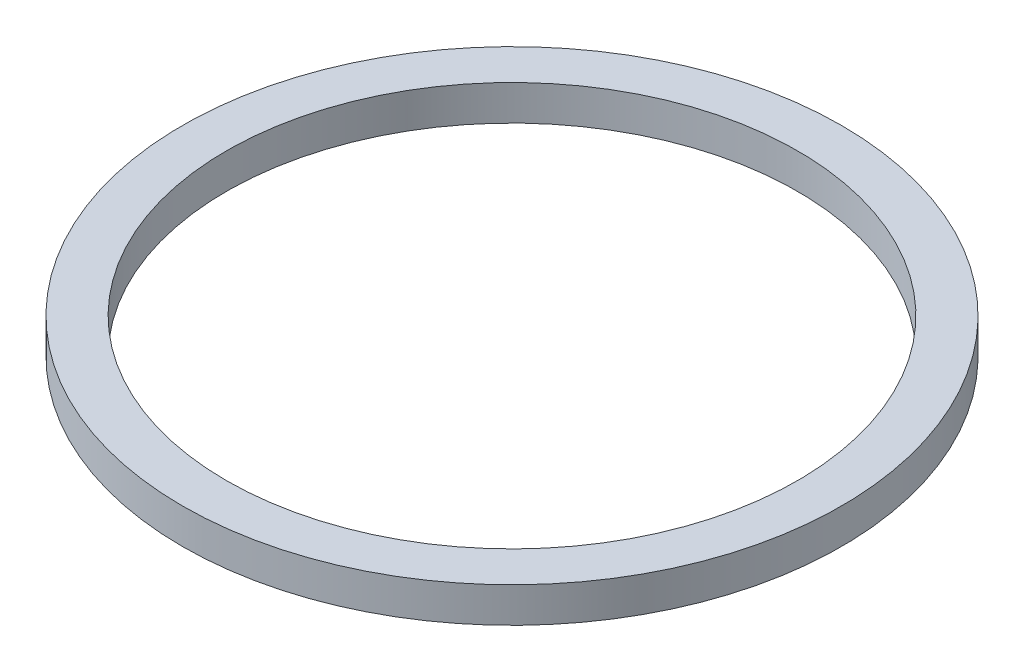
ISO-10303-21;
HEADER;
FILE_DESCRIPTION(('STEP AP214'),'2;1');
FILE_NAME('part.step','',(''),(''),'','','');
FILE_SCHEMA(('AUTOMOTIVE_DESIGN { 1 0 10303 214 1 1 1 1 }'));
ENDSEC;
DATA;
#1=APPLICATION_CONTEXT('core data for automotive mechanical design processes');
#2=APPLICATION_PROTOCOL_DEFINITION('international standard','automotive_design',2000,#1);
#3=PRODUCT_CONTEXT('',#1,'mechanical');
#4=PRODUCT('Part','Part','',(#3));
#5=PRODUCT_RELATED_PRODUCT_CATEGORY('part','',(#4));
#6=PRODUCT_DEFINITION_FORMATION('','',#4);
#7=PRODUCT_DEFINITION_CONTEXT('part definition',#1,'design');
#8=PRODUCT_DEFINITION('design','',#6,#7);
#9=PRODUCT_DEFINITION_SHAPE('','',#8);
#10=(LENGTH_UNIT() NAMED_UNIT(*) SI_UNIT(.MILLI.,.METRE.));
#11=(NAMED_UNIT(*) PLANE_ANGLE_UNIT() SI_UNIT($,.RADIAN.));
#12=(NAMED_UNIT(*) SI_UNIT($,.STERADIAN.) SOLID_ANGLE_UNIT());
#13=UNCERTAINTY_MEASURE_WITH_UNIT(LENGTH_MEASURE(1.E-05),#10,'distance_accuracy_value','');
#14=(GEOMETRIC_REPRESENTATION_CONTEXT(3) GLOBAL_UNCERTAINTY_ASSIGNED_CONTEXT((#13)) GLOBAL_UNIT_ASSIGNED_CONTEXT((#10,
#11,#12)) REPRESENTATION_CONTEXT('',''));
#15=CARTESIAN_POINT('',(0.,0.,0.));
#16=DIRECTION('',(0.,0.,1.));
#17=DIRECTION('',(1.,0.,0.));
#18=AXIS2_PLACEMENT_3D('',#15,#16,#17);
#19=CARTESIAN_POINT('',(0.,2.54,0.));
#20=DIRECTION('',(0.,1.,0.));
#21=DIRECTION('',(0.,0.,1.));
#22=AXIS2_PLACEMENT_3D('',#19,#20,#21);
#23=PLANE('',#22);
#24=CARTESIAN_POINT('',(0.,2.54,0.));
#25=DIRECTION('',(0.,1.,0.));
#26=DIRECTION('',(0.,0.,1.));
#27=AXIS2_PLACEMENT_3D('',#24,#25,#26);
#28=CIRCLE('',#27,23.8125);
#29=CARTESIAN_POINT('',(0.,2.54,23.8125));
#30=VERTEX_POINT('',#29);
#31=EDGE_CURVE('E10',#30,#30,#28,.T.);
#32=ORIENTED_EDGE('',*,*,#31,.T.);
#33=EDGE_LOOP('',(#32));
#34=FACE_BOUND('',#33,.T.);
#35=CARTESIAN_POINT('',(0.,2.54,0.));
#36=DIRECTION('',(0.,1.,0.));
#37=DIRECTION('',(0.,0.,1.));
#38=AXIS2_PLACEMENT_3D('',#35,#36,#37);
#39=CIRCLE('',#38,20.6375);
#40=CARTESIAN_POINT('',(0.,2.54,20.6375));
#41=VERTEX_POINT('',#40);
#42=EDGE_CURVE('E46',#41,#41,#39,.T.);
#43=ORIENTED_EDGE('',*,*,#42,.F.);
#44=EDGE_LOOP('',(#43));
#45=FACE_BOUND('',#44,.T.);
#46=ADVANCED_FACE('F35',(#34,#45),#23,.T.);
#47=CARTESIAN_POINT('',(0.,0.,0.));
#48=DIRECTION('',(0.,1.,0.));
#49=DIRECTION('',(0.,0.,1.));
#50=AXIS2_PLACEMENT_3D('',#47,#48,#49);
#51=PLANE('',#50);
#52=CARTESIAN_POINT('',(0.,0.,0.));
#53=DIRECTION('',(0.,1.,0.));
#54=DIRECTION('',(0.,0.,1.));
#55=AXIS2_PLACEMENT_3D('',#52,#53,#54);
#56=CIRCLE('',#55,23.8125);
#57=CARTESIAN_POINT('',(0.,0.,23.8125));
#58=VERTEX_POINT('',#57);
#59=EDGE_CURVE('E39',#58,#58,#56,.T.);
#60=ORIENTED_EDGE('',*,*,#59,.F.);
#61=EDGE_LOOP('',(#60));
#62=FACE_BOUND('',#61,.T.);
#63=CARTESIAN_POINT('',(0.,0.,0.));
#64=DIRECTION('',(0.,1.,0.));
#65=DIRECTION('',(0.,0.,1.));
#66=AXIS2_PLACEMENT_3D('',#63,#64,#65);
#67=CIRCLE('',#66,20.6375);
#68=CARTESIAN_POINT('',(0.,0.,20.6375));
#69=VERTEX_POINT('',#68);
#70=EDGE_CURVE('E48',#69,#69,#67,.T.);
#71=ORIENTED_EDGE('',*,*,#70,.T.);
#72=EDGE_LOOP('',(#71));
#73=FACE_BOUND('',#72,.T.);
#74=ADVANCED_FACE('F58',(#62,#73),#51,.F.);
#75=CARTESIAN_POINT('',(0.,2.54,0.));
#76=DIRECTION('',(0.,-1.,0.));
#77=DIRECTION('',(0.,0.,-1.));
#78=AXIS2_PLACEMENT_3D('',#75,#76,#77);
#79=CYLINDRICAL_SURFACE('',#78,23.8125);
#80=ORIENTED_EDGE('',*,*,#31,.F.);
#81=EDGE_LOOP('',(#80));
#82=FACE_BOUND('',#81,.T.);
#83=ORIENTED_EDGE('',*,*,#59,.T.);
#84=EDGE_LOOP('',(#83));
#85=FACE_BOUND('',#84,.T.);
#86=ADVANCED_FACE('F37',(#82,#85),#79,.T.);
#87=CARTESIAN_POINT('',(0.,2.54,0.));
#88=DIRECTION('',(0.,-1.,0.));
#89=DIRECTION('',(0.,0.,-1.));
#90=AXIS2_PLACEMENT_3D('',#87,#88,#89);
#91=CYLINDRICAL_SURFACE('',#90,20.6375);
#92=ORIENTED_EDGE('',*,*,#42,.T.);
#93=EDGE_LOOP('',(#92));
#94=FACE_BOUND('',#93,.T.);
#95=ORIENTED_EDGE('',*,*,#70,.F.);
#96=EDGE_LOOP('',(#95));
#97=FACE_BOUND('',#96,.T.);
#98=ADVANCED_FACE('F54',(#94,#97),#91,.F.);
#99=CLOSED_SHELL('',(#46,#74,#86,#98));
#100=MANIFOLD_SOLID_BREP('B2',#99);
#101=ADVANCED_BREP_SHAPE_REPRESENTATION('',(#18,#100),#14);
#102=SHAPE_DEFINITION_REPRESENTATION(#9,#101);
ENDSEC;
END-ISO-10303-21;
